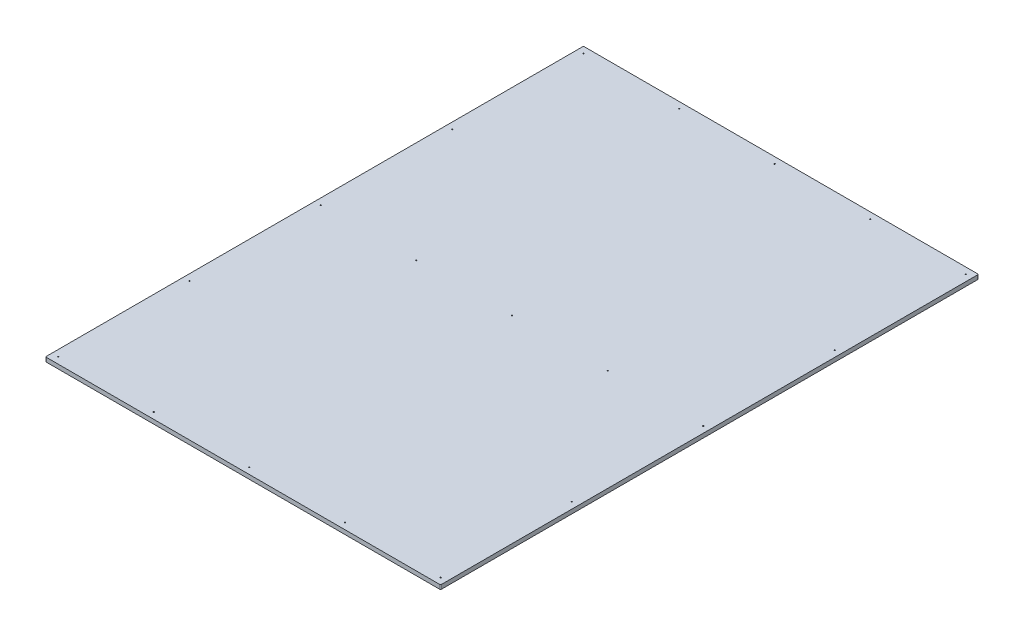
ISO-10303-21;
HEADER;
FILE_DESCRIPTION(('STEP AP214'),'2;1');
FILE_NAME('part.step','',(''),(''),'','','');
FILE_SCHEMA(('AUTOMOTIVE_DESIGN { 1 0 10303 214 1 1 1 1 }'));
ENDSEC;
DATA;
#1=APPLICATION_CONTEXT('core data for automotive mechanical design processes');
#2=APPLICATION_PROTOCOL_DEFINITION('international standard','automotive_design',2000,#1);
#3=PRODUCT_CONTEXT('',#1,'mechanical');
#4=PRODUCT('Part','Part','',(#3));
#5=PRODUCT_RELATED_PRODUCT_CATEGORY('part','',(#4));
#6=PRODUCT_DEFINITION_FORMATION('','',#4);
#7=PRODUCT_DEFINITION_CONTEXT('part definition',#1,'design');
#8=PRODUCT_DEFINITION('design','',#6,#7);
#9=PRODUCT_DEFINITION_SHAPE('','',#8);
#10=(LENGTH_UNIT() NAMED_UNIT(*) SI_UNIT(.MILLI.,.METRE.));
#11=(NAMED_UNIT(*) PLANE_ANGLE_UNIT() SI_UNIT($,.RADIAN.));
#12=(NAMED_UNIT(*) SI_UNIT($,.STERADIAN.) SOLID_ANGLE_UNIT());
#13=UNCERTAINTY_MEASURE_WITH_UNIT(LENGTH_MEASURE(1.E-05),#10,'distance_accuracy_value','');
#14=(GEOMETRIC_REPRESENTATION_CONTEXT(3) GLOBAL_UNCERTAINTY_ASSIGNED_CONTEXT((#13)) GLOBAL_UNIT_ASSIGNED_CONTEXT((#10,
#11,#12)) REPRESENTATION_CONTEXT('',''));
#15=CARTESIAN_POINT('',(0.,0.,0.));
#16=DIRECTION('',(0.,0.,1.));
#17=DIRECTION('',(1.,0.,0.));
#18=AXIS2_PLACEMENT_3D('',#15,#16,#17);
#19=CARTESIAN_POINT('',(0.,12.7,0.));
#20=DIRECTION('',(0.,-1.,0.));
#21=DIRECTION('',(0.,0.,-1.));
#22=AXIS2_PLACEMENT_3D('',#19,#20,#21);
#23=PLANE('',#22);
#24=CARTESIAN_POINT('',(-577.85,12.7,396.875));
#25=DIRECTION('',(0.,1.,0.));
#26=DIRECTION('',(0.,0.,1.));
#27=AXIS2_PLACEMENT_3D('',#24,#25,#26);
#28=CIRCLE('',#27,1.58749999999996);
#29=CARTESIAN_POINT('',(-577.85,12.7,398.4625));
#30=VERTEX_POINT('',#29);
#31=EDGE_CURVE('E287',#30,#30,#28,.T.);
#32=ORIENTED_EDGE('',*,*,#31,.F.);
#33=EDGE_LOOP('',(#32));
#34=FACE_BOUND('',#33,.T.);
#35=CARTESIAN_POINT('',(577.85,12.7,396.875));
#36=DIRECTION('',(0.,1.,0.));
#37=DIRECTION('',(0.,0.,1.));
#38=AXIS2_PLACEMENT_3D('',#35,#36,#37);
#39=CIRCLE('',#38,1.58749999999996);
#40=CARTESIAN_POINT('',(577.85,12.7,398.4625));
#41=VERTEX_POINT('',#40);
#42=EDGE_CURVE('E281',#41,#41,#39,.T.);
#43=ORIENTED_EDGE('',*,*,#42,.F.);
#44=EDGE_LOOP('',(#43));
#45=FACE_BOUND('',#44,.T.);
#46=CARTESIAN_POINT('',(-577.85,12.7,-396.875));
#47=DIRECTION('',(0.,1.,0.));
#48=DIRECTION('',(0.,0.,1.));
#49=AXIS2_PLACEMENT_3D('',#46,#47,#48);
#50=CIRCLE('',#49,1.58749999999996);
#51=CARTESIAN_POINT('',(-577.85,12.7,-395.2875));
#52=VERTEX_POINT('',#51);
#53=EDGE_CURVE('E275',#52,#52,#50,.T.);
#54=ORIENTED_EDGE('',*,*,#53,.F.);
#55=EDGE_LOOP('',(#54));
#56=FACE_BOUND('',#55,.T.);
#57=CARTESIAN_POINT('',(577.85,12.7,-396.875));
#58=DIRECTION('',(0.,1.,0.));
#59=DIRECTION('',(0.,0.,1.));
#60=AXIS2_PLACEMENT_3D('',#57,#58,#59);
#61=CIRCLE('',#60,1.58749999999996);
#62=CARTESIAN_POINT('',(577.85,12.7,-395.2875));
#63=VERTEX_POINT('',#62);
#64=EDGE_CURVE('E269',#63,#63,#61,.T.);
#65=ORIENTED_EDGE('',*,*,#64,.F.);
#66=EDGE_LOOP('',(#65));
#67=FACE_BOUND('',#66,.T.);
#68=CARTESIAN_POINT('',(-577.85,12.7,-793.75));
#69=DIRECTION('',(0.,1.,0.));
#70=DIRECTION('',(0.,0.,1.));
#71=AXIS2_PLACEMENT_3D('',#68,#69,#70);
#72=CIRCLE('',#71,1.58749999999996);
#73=CARTESIAN_POINT('',(-577.85,12.7,-792.1625));
#74=VERTEX_POINT('',#73);
#75=EDGE_CURVE('E257',#74,#74,#72,.T.);
#76=ORIENTED_EDGE('',*,*,#75,.F.);
#77=EDGE_LOOP('',(#76));
#78=FACE_BOUND('',#77,.T.);
#79=CARTESIAN_POINT('',(-288.925,12.7,-793.75));
#80=DIRECTION('',(0.,1.,0.));
#81=DIRECTION('',(0.,0.,1.));
#82=AXIS2_PLACEMENT_3D('',#79,#80,#81);
#83=CIRCLE('',#82,1.58750000000002);
#84=CARTESIAN_POINT('',(-288.925,12.7,-792.1625));
#85=VERTEX_POINT('',#84);
#86=EDGE_CURVE('E251',#85,#85,#83,.T.);
#87=ORIENTED_EDGE('',*,*,#86,.F.);
#88=EDGE_LOOP('',(#87));
#89=FACE_BOUND('',#88,.T.);
#90=CARTESIAN_POINT('',(0.,12.7,-793.75));
#91=DIRECTION('',(0.,1.,0.));
#92=DIRECTION('',(0.,0.,1.));
#93=AXIS2_PLACEMENT_3D('',#90,#91,#92);
#94=CIRCLE('',#93,1.5875);
#95=CARTESIAN_POINT('',(0.,12.7,-792.1625));
#96=VERTEX_POINT('',#95);
#97=EDGE_CURVE('E245',#96,#96,#94,.T.);
#98=ORIENTED_EDGE('',*,*,#97,.F.);
#99=EDGE_LOOP('',(#98));
#100=FACE_BOUND('',#99,.T.);
#101=CARTESIAN_POINT('',(288.925,12.7,-793.75));
#102=DIRECTION('',(0.,1.,0.));
#103=DIRECTION('',(0.,0.,1.));
#104=AXIS2_PLACEMENT_3D('',#101,#102,#103);
#105=CIRCLE('',#104,1.58750000000002);
#106=CARTESIAN_POINT('',(288.925,12.7,-792.1625));
#107=VERTEX_POINT('',#106);
#108=EDGE_CURVE('E239',#107,#107,#105,.T.);
#109=ORIENTED_EDGE('',*,*,#108,.F.);
#110=EDGE_LOOP('',(#109));
#111=FACE_BOUND('',#110,.T.);
#112=CARTESIAN_POINT('',(-288.925,12.7,793.75));
#113=DIRECTION('',(0.,1.,0.));
#114=DIRECTION('',(0.,0.,1.));
#115=AXIS2_PLACEMENT_3D('',#112,#113,#114);
#116=CIRCLE('',#115,1.58750000000002);
#117=CARTESIAN_POINT('',(-288.925,12.7,795.3375));
#118=VERTEX_POINT('',#117);
#119=EDGE_CURVE('E227',#118,#118,#116,.T.);
#120=ORIENTED_EDGE('',*,*,#119,.F.);
#121=EDGE_LOOP('',(#120));
#122=FACE_BOUND('',#121,.T.);
#123=CARTESIAN_POINT('',(288.925,12.7,793.75));
#124=DIRECTION('',(0.,1.,0.));
#125=DIRECTION('',(0.,0.,1.));
#126=AXIS2_PLACEMENT_3D('',#123,#124,#125);
#127=CIRCLE('',#126,1.58750000000002);
#128=CARTESIAN_POINT('',(288.925,12.7,795.3375));
#129=VERTEX_POINT('',#128);
#130=EDGE_CURVE('E215',#129,#129,#127,.T.);
#131=ORIENTED_EDGE('',*,*,#130,.F.);
#132=EDGE_LOOP('',(#131));
#133=FACE_BOUND('',#132,.T.);
#134=CARTESIAN_POINT('',(577.85,12.7,793.75));
#135=DIRECTION('',(0.,1.,0.));
#136=DIRECTION('',(0.,0.,1.));
#137=AXIS2_PLACEMENT_3D('',#134,#135,#136);
#138=CIRCLE('',#137,1.58749999999996);
#139=CARTESIAN_POINT('',(577.85,12.7,795.3375));
#140=VERTEX_POINT('',#139);
#141=EDGE_CURVE('E209',#140,#140,#138,.T.);
#142=ORIENTED_EDGE('',*,*,#141,.F.);
#143=EDGE_LOOP('',(#142));
#144=FACE_BOUND('',#143,.T.);
#145=CARTESIAN_POINT('',(-577.85,12.7,-3.33066907387547E-13));
#146=DIRECTION('',(0.,1.,0.));
#147=DIRECTION('',(0.,0.,1.));
#148=AXIS2_PLACEMENT_3D('',#145,#146,#147);
#149=CIRCLE('',#148,1.58749999999996);
#150=CARTESIAN_POINT('',(-577.85,12.7,1.58749999999963));
#151=VERTEX_POINT('',#150);
#152=EDGE_CURVE('E203',#151,#151,#149,.T.);
#153=ORIENTED_EDGE('',*,*,#152,.F.);
#154=EDGE_LOOP('',(#153));
#155=FACE_BOUND('',#154,.T.);
#156=CARTESIAN_POINT('',(-288.925,12.7,-3.33066907387547E-13));
#157=DIRECTION('',(0.,1.,0.));
#158=DIRECTION('',(0.,0.,1.));
#159=AXIS2_PLACEMENT_3D('',#156,#157,#158);
#160=CIRCLE('',#159,1.58750000000002);
#161=CARTESIAN_POINT('',(-288.925,12.7,1.58749999999969));
#162=VERTEX_POINT('',#161);
#163=EDGE_CURVE('E197',#162,#162,#160,.T.);
#164=ORIENTED_EDGE('',*,*,#163,.F.);
#165=EDGE_LOOP('',(#164));
#166=FACE_BOUND('',#165,.T.);
#167=CARTESIAN_POINT('',(0.,12.7,-3.33066907387547E-13));
#168=DIRECTION('',(0.,1.,0.));
#169=DIRECTION('',(0.,0.,1.));
#170=AXIS2_PLACEMENT_3D('',#167,#168,#169);
#171=CIRCLE('',#170,1.5875);
#172=CARTESIAN_POINT('',(0.,12.7,1.58749999999966));
#173=VERTEX_POINT('',#172);
#174=EDGE_CURVE('E191',#173,#173,#171,.T.);
#175=ORIENTED_EDGE('',*,*,#174,.F.);
#176=EDGE_LOOP('',(#175));
#177=FACE_BOUND('',#176,.T.);
#178=CARTESIAN_POINT('',(288.925,12.7,-3.33066907387547E-13));
#179=DIRECTION('',(0.,1.,0.));
#180=DIRECTION('',(0.,0.,1.));
#181=AXIS2_PLACEMENT_3D('',#178,#179,#180);
#182=CIRCLE('',#181,1.58750000000002);
#183=CARTESIAN_POINT('',(288.925,12.7,1.58749999999969));
#184=VERTEX_POINT('',#183);
#185=EDGE_CURVE('E185',#184,#184,#182,.T.);
#186=ORIENTED_EDGE('',*,*,#185,.F.);
#187=EDGE_LOOP('',(#186));
#188=FACE_BOUND('',#187,.T.);
#189=CARTESIAN_POINT('',(577.85,12.7,-3.33066907387547E-13));
#190=DIRECTION('',(0.,1.,0.));
#191=DIRECTION('',(0.,0.,1.));
#192=AXIS2_PLACEMENT_3D('',#189,#190,#191);
#193=CIRCLE('',#192,1.58749999999996);
#194=CARTESIAN_POINT('',(577.85,12.7,1.58749999999963));
#195=VERTEX_POINT('',#194);
#196=EDGE_CURVE('E179',#195,#195,#193,.T.);
#197=ORIENTED_EDGE('',*,*,#196,.F.);
#198=EDGE_LOOP('',(#197));
#199=FACE_BOUND('',#198,.T.);
#200=DIRECTION('',(0.,0.,-1.));
#201=VECTOR('',#200,1.);
#202=CARTESIAN_POINT('',(596.9,12.7,812.8));
#203=LINE('',#202,#201);
#204=CARTESIAN_POINT('',(596.9,12.7,810.26));
#205=VERTEX_POINT('',#204);
#206=CARTESIAN_POINT('',(596.9,12.7,-810.26));
#207=VERTEX_POINT('',#206);
#208=EDGE_CURVE('E137',#205,#207,#203,.T.);
#209=ORIENTED_EDGE('',*,*,#208,.T.);
#210=CARTESIAN_POINT('',(594.36,12.7,-810.26));
#211=DIRECTION('',(0.,-1.,0.));
#212=DIRECTION('',(0.,0.,-1.));
#213=AXIS2_PLACEMENT_3D('',#210,#211,#212);
#214=CIRCLE('',#213,2.54);
#215=CARTESIAN_POINT('',(594.36,12.7,-812.8));
#216=VERTEX_POINT('',#215);
#217=EDGE_CURVE('E152',#207,#216,#214,.F.);
#218=ORIENTED_EDGE('',*,*,#217,.T.);
#219=DIRECTION('',(-1.,0.,0.));
#220=VECTOR('',#219,1.);
#221=CARTESIAN_POINT('',(-596.9,12.7,-812.8));
#222=LINE('',#221,#220);
#223=CARTESIAN_POINT('',(-594.36,12.7,-812.8));
#224=VERTEX_POINT('',#223);
#225=EDGE_CURVE('E120',#216,#224,#222,.T.);
#226=ORIENTED_EDGE('',*,*,#225,.T.);
#227=CARTESIAN_POINT('',(-594.36,12.7,-810.26));
#228=DIRECTION('',(0.,-1.,0.));
#229=DIRECTION('',(0.,0.,-1.));
#230=AXIS2_PLACEMENT_3D('',#227,#228,#229);
#231=CIRCLE('',#230,2.54);
#232=CARTESIAN_POINT('',(-596.9,12.7,-810.26));
#233=VERTEX_POINT('',#232);
#234=EDGE_CURVE('E150',#224,#233,#231,.F.);
#235=ORIENTED_EDGE('',*,*,#234,.T.);
#236=DIRECTION('',(0.,0.,1.));
#237=VECTOR('',#236,1.);
#238=CARTESIAN_POINT('',(-596.9,12.7,812.8));
#239=LINE('',#238,#237);
#240=CARTESIAN_POINT('',(-596.9,12.7,810.26));
#241=VERTEX_POINT('',#240);
#242=EDGE_CURVE('E163',#233,#241,#239,.T.);
#243=ORIENTED_EDGE('',*,*,#242,.T.);
#244=CARTESIAN_POINT('',(-594.36,12.7,810.26));
#245=DIRECTION('',(0.,-1.,0.));
#246=DIRECTION('',(0.,0.,-1.));
#247=AXIS2_PLACEMENT_3D('',#244,#245,#246);
#248=CIRCLE('',#247,2.54);
#249=CARTESIAN_POINT('',(-594.36,12.7,812.8));
#250=VERTEX_POINT('',#249);
#251=EDGE_CURVE('E55',#241,#250,#248,.F.);
#252=ORIENTED_EDGE('',*,*,#251,.T.);
#253=DIRECTION('',(1.,0.,0.));
#254=VECTOR('',#253,1.);
#255=CARTESIAN_POINT('',(-596.9,12.7,812.8));
#256=LINE('',#255,#254);
#257=CARTESIAN_POINT('',(594.36,12.7,812.8));
#258=VERTEX_POINT('',#257);
#259=EDGE_CURVE('E138',#250,#258,#256,.T.);
#260=ORIENTED_EDGE('',*,*,#259,.T.);
#261=CARTESIAN_POINT('',(594.36,12.7,810.26));
#262=DIRECTION('',(0.,-1.,0.));
#263=DIRECTION('',(0.,0.,-1.));
#264=AXIS2_PLACEMENT_3D('',#261,#262,#263);
#265=CIRCLE('',#264,2.54);
#266=EDGE_CURVE('E147',#258,#205,#265,.F.);
#267=ORIENTED_EDGE('',*,*,#266,.T.);
#268=EDGE_LOOP('',(#209,#218,#226,#235,#243,#252,#260,#267));
#269=FACE_BOUND('',#268,.T.);
#270=CARTESIAN_POINT('',(0.,12.7,793.75));
#271=DIRECTION('',(0.,1.,0.));
#272=DIRECTION('',(0.,0.,1.));
#273=AXIS2_PLACEMENT_3D('',#270,#271,#272);
#274=CIRCLE('',#273,1.5875);
#275=CARTESIAN_POINT('',(0.,12.7,795.3375));
#276=VERTEX_POINT('',#275);
#277=EDGE_CURVE('E221',#276,#276,#274,.T.);
#278=ORIENTED_EDGE('',*,*,#277,.F.);
#279=EDGE_LOOP('',(#278));
#280=FACE_BOUND('',#279,.T.);
#281=CARTESIAN_POINT('',(577.85,12.7,-793.75));
#282=DIRECTION('',(0.,1.,0.));
#283=DIRECTION('',(0.,0.,1.));
#284=AXIS2_PLACEMENT_3D('',#281,#282,#283);
#285=CIRCLE('',#284,1.58749999999996);
#286=CARTESIAN_POINT('',(577.85,12.7,-792.1625));
#287=VERTEX_POINT('',#286);
#288=EDGE_CURVE('E233',#287,#287,#285,.T.);
#289=ORIENTED_EDGE('',*,*,#288,.F.);
#290=EDGE_LOOP('',(#289));
#291=FACE_BOUND('',#290,.T.);
#292=CARTESIAN_POINT('',(-577.85,12.7,793.75));
#293=DIRECTION('',(0.,1.,0.));
#294=DIRECTION('',(0.,0.,1.));
#295=AXIS2_PLACEMENT_3D('',#292,#293,#294);
#296=CIRCLE('',#295,1.58749999999996);
#297=CARTESIAN_POINT('',(-577.85,12.7,795.3375));
#298=VERTEX_POINT('',#297);
#299=EDGE_CURVE('E263',#298,#298,#296,.T.);
#300=ORIENTED_EDGE('',*,*,#299,.F.);
#301=EDGE_LOOP('',(#300));
#302=FACE_BOUND('',#301,.T.);
#303=ADVANCED_FACE('F34',(#34,#45,#56,#67,#78,#89,#100,#111,#122,#133,#144,#155,#166,#177,#188,
#199,#269,#280,#291,#302),#23,.F.);
#304=CARTESIAN_POINT('',(596.9,12.7,812.8));
#305=DIRECTION('',(-1.,0.,0.));
#306=DIRECTION('',(0.,0.,1.));
#307=AXIS2_PLACEMENT_3D('',#304,#305,#306);
#308=PLANE('',#307);
#309=DIRECTION('',(0.,0.,-1.));
#310=VECTOR('',#309,1.);
#311=CARTESIAN_POINT('',(596.9,0.,812.8));
#312=LINE('',#311,#310);
#313=CARTESIAN_POINT('',(596.9,0.,810.26));
#314=VERTEX_POINT('',#313);
#315=CARTESIAN_POINT('',(596.9,0.,-810.26));
#316=VERTEX_POINT('',#315);
#317=EDGE_CURVE('E127',#314,#316,#312,.T.);
#318=ORIENTED_EDGE('',*,*,#317,.T.);
#319=DIRECTION('',(0.,-1.,0.));
#320=VECTOR('',#319,1.);
#321=CARTESIAN_POINT('',(596.9,12.7,-810.26));
#322=LINE('',#321,#320);
#323=EDGE_CURVE('E105',#316,#207,#322,.F.);
#324=ORIENTED_EDGE('',*,*,#323,.T.);
#325=ORIENTED_EDGE('',*,*,#208,.F.);
#326=DIRECTION('',(0.,-1.,0.));
#327=VECTOR('',#326,1.);
#328=CARTESIAN_POINT('',(596.9,12.7,810.26));
#329=LINE('',#328,#327);
#330=EDGE_CURVE('E110',#205,#314,#329,.T.);
#331=ORIENTED_EDGE('',*,*,#330,.T.);
#332=EDGE_LOOP('',(#318,#324,#325,#331));
#333=FACE_BOUND('',#332,.T.);
#334=ADVANCED_FACE('F296',(#333),#308,.F.);
#335=CARTESIAN_POINT('',(-596.9,12.7,-812.8));
#336=DIRECTION('',(0.,0.,1.));
#337=DIRECTION('',(1.,0.,0.));
#338=AXIS2_PLACEMENT_3D('',#335,#336,#337);
#339=PLANE('',#338);
#340=ORIENTED_EDGE('',*,*,#225,.F.);
#341=DIRECTION('',(0.,-1.,0.));
#342=VECTOR('',#341,1.);
#343=CARTESIAN_POINT('',(594.36,12.7,-812.8));
#344=LINE('',#343,#342);
#345=CARTESIAN_POINT('',(594.36,0.,-812.8));
#346=VERTEX_POINT('',#345);
#347=EDGE_CURVE('E104',#216,#346,#344,.T.);
#348=ORIENTED_EDGE('',*,*,#347,.T.);
#349=DIRECTION('',(-1.,0.,0.));
#350=VECTOR('',#349,1.);
#351=CARTESIAN_POINT('',(-596.9,0.,-812.8));
#352=LINE('',#351,#350);
#353=CARTESIAN_POINT('',(-594.36,0.,-812.8));
#354=VERTEX_POINT('',#353);
#355=EDGE_CURVE('E117',#346,#354,#352,.T.);
#356=ORIENTED_EDGE('',*,*,#355,.T.);
#357=DIRECTION('',(0.,-1.,0.));
#358=VECTOR('',#357,1.);
#359=CARTESIAN_POINT('',(-594.36,12.7,-812.8));
#360=LINE('',#359,#358);
#361=EDGE_CURVE('E122',#354,#224,#360,.F.);
#362=ORIENTED_EDGE('',*,*,#361,.T.);
#363=EDGE_LOOP('',(#340,#348,#356,#362));
#364=FACE_BOUND('',#363,.T.);
#365=ADVANCED_FACE('F116',(#364),#339,.F.);
#366=CARTESIAN_POINT('',(-596.9,12.7,812.8));
#367=DIRECTION('',(1.,0.,0.));
#368=DIRECTION('',(0.,0.,-1.));
#369=AXIS2_PLACEMENT_3D('',#366,#367,#368);
#370=PLANE('',#369);
#371=ORIENTED_EDGE('',*,*,#242,.F.);
#372=DIRECTION('',(0.,-1.,0.));
#373=VECTOR('',#372,1.);
#374=CARTESIAN_POINT('',(-596.9,12.7,-810.26));
#375=LINE('',#374,#373);
#376=CARTESIAN_POINT('',(-596.9,0.,-810.26));
#377=VERTEX_POINT('',#376);
#378=EDGE_CURVE('E156',#233,#377,#375,.T.);
#379=ORIENTED_EDGE('',*,*,#378,.T.);
#380=DIRECTION('',(0.,0.,1.));
#381=VECTOR('',#380,1.);
#382=CARTESIAN_POINT('',(-596.9,0.,812.8));
#383=LINE('',#382,#381);
#384=CARTESIAN_POINT('',(-596.9,0.,810.26));
#385=VERTEX_POINT('',#384);
#386=EDGE_CURVE('E126',#377,#385,#383,.T.);
#387=ORIENTED_EDGE('',*,*,#386,.T.);
#388=DIRECTION('',(0.,-1.,0.));
#389=VECTOR('',#388,1.);
#390=CARTESIAN_POINT('',(-596.9,12.7,810.26));
#391=LINE('',#390,#389);
#392=EDGE_CURVE('E154',#385,#241,#391,.F.);
#393=ORIENTED_EDGE('',*,*,#392,.T.);
#394=EDGE_LOOP('',(#371,#379,#387,#393));
#395=FACE_BOUND('',#394,.T.);
#396=ADVANCED_FACE('F161',(#395),#370,.F.);
#397=CARTESIAN_POINT('',(-596.9,12.7,812.8));
#398=DIRECTION('',(0.,0.,-1.));
#399=DIRECTION('',(-1.,0.,0.));
#400=AXIS2_PLACEMENT_3D('',#397,#398,#399);
#401=PLANE('',#400);
#402=ORIENTED_EDGE('',*,*,#259,.F.);
#403=DIRECTION('',(0.,-1.,0.));
#404=VECTOR('',#403,1.);
#405=CARTESIAN_POINT('',(-594.36,12.7,812.8));
#406=LINE('',#405,#404);
#407=CARTESIAN_POINT('',(-594.36,0.,812.8));
#408=VERTEX_POINT('',#407);
#409=EDGE_CURVE('E11',#250,#408,#406,.T.);
#410=ORIENTED_EDGE('',*,*,#409,.T.);
#411=DIRECTION('',(1.,0.,0.));
#412=VECTOR('',#411,1.);
#413=CARTESIAN_POINT('',(-596.9,0.,812.8));
#414=LINE('',#413,#412);
#415=CARTESIAN_POINT('',(594.36,0.,812.8));
#416=VERTEX_POINT('',#415);
#417=EDGE_CURVE('E130',#408,#416,#414,.T.);
#418=ORIENTED_EDGE('',*,*,#417,.T.);
#419=DIRECTION('',(0.,-1.,0.));
#420=VECTOR('',#419,1.);
#421=CARTESIAN_POINT('',(594.36,12.7,812.8));
#422=LINE('',#421,#420);
#423=EDGE_CURVE('E42',#416,#258,#422,.F.);
#424=ORIENTED_EDGE('',*,*,#423,.T.);
#425=EDGE_LOOP('',(#402,#410,#418,#424));
#426=FACE_BOUND('',#425,.T.);
#427=ADVANCED_FACE('F170',(#426),#401,.F.);
#428=CARTESIAN_POINT('',(0.,0.,0.));
#429=DIRECTION('',(0.,-1.,0.));
#430=DIRECTION('',(0.,0.,-1.));
#431=AXIS2_PLACEMENT_3D('',#428,#429,#430);
#432=PLANE('',#431);
#433=CARTESIAN_POINT('',(-577.85,0.,396.875));
#434=DIRECTION('',(0.,-1.,0.));
#435=DIRECTION('',(0.,0.,-1.));
#436=AXIS2_PLACEMENT_3D('',#433,#434,#435);
#437=CIRCLE('',#436,1.58749999999996);
#438=CARTESIAN_POINT('',(-577.85,0.,395.2875));
#439=VERTEX_POINT('',#438);
#440=EDGE_CURVE('E284',#439,#439,#437,.T.);
#441=ORIENTED_EDGE('',*,*,#440,.F.);
#442=EDGE_LOOP('',(#441));
#443=FACE_BOUND('',#442,.T.);
#444=CARTESIAN_POINT('',(577.85,0.,396.875));
#445=DIRECTION('',(0.,-1.,0.));
#446=DIRECTION('',(0.,0.,-1.));
#447=AXIS2_PLACEMENT_3D('',#444,#445,#446);
#448=CIRCLE('',#447,1.58749999999996);
#449=CARTESIAN_POINT('',(577.85,0.,395.2875));
#450=VERTEX_POINT('',#449);
#451=EDGE_CURVE('E278',#450,#450,#448,.T.);
#452=ORIENTED_EDGE('',*,*,#451,.F.);
#453=EDGE_LOOP('',(#452));
#454=FACE_BOUND('',#453,.T.);
#455=CARTESIAN_POINT('',(-577.85,0.,-396.875));
#456=DIRECTION('',(0.,-1.,0.));
#457=DIRECTION('',(0.,0.,-1.));
#458=AXIS2_PLACEMENT_3D('',#455,#456,#457);
#459=CIRCLE('',#458,1.58749999999996);
#460=CARTESIAN_POINT('',(-577.85,0.,-398.4625));
#461=VERTEX_POINT('',#460);
#462=EDGE_CURVE('E272',#461,#461,#459,.T.);
#463=ORIENTED_EDGE('',*,*,#462,.F.);
#464=EDGE_LOOP('',(#463));
#465=FACE_BOUND('',#464,.T.);
#466=CARTESIAN_POINT('',(577.85,0.,-396.875));
#467=DIRECTION('',(0.,-1.,0.));
#468=DIRECTION('',(0.,0.,-1.));
#469=AXIS2_PLACEMENT_3D('',#466,#467,#468);
#470=CIRCLE('',#469,1.58749999999996);
#471=CARTESIAN_POINT('',(577.85,0.,-398.4625));
#472=VERTEX_POINT('',#471);
#473=EDGE_CURVE('E266',#472,#472,#470,.T.);
#474=ORIENTED_EDGE('',*,*,#473,.F.);
#475=EDGE_LOOP('',(#474));
#476=FACE_BOUND('',#475,.T.);
#477=CARTESIAN_POINT('',(-577.85,0.,793.75));
#478=DIRECTION('',(0.,-1.,0.));
#479=DIRECTION('',(0.,0.,-1.));
#480=AXIS2_PLACEMENT_3D('',#477,#478,#479);
#481=CIRCLE('',#480,1.58749999999996);
#482=CARTESIAN_POINT('',(-577.85,0.,792.1625));
#483=VERTEX_POINT('',#482);
#484=EDGE_CURVE('E260',#483,#483,#481,.T.);
#485=ORIENTED_EDGE('',*,*,#484,.F.);
#486=EDGE_LOOP('',(#485));
#487=FACE_BOUND('',#486,.T.);
#488=CARTESIAN_POINT('',(-577.85,0.,-793.75));
#489=DIRECTION('',(0.,-1.,0.));
#490=DIRECTION('',(0.,0.,-1.));
#491=AXIS2_PLACEMENT_3D('',#488,#489,#490);
#492=CIRCLE('',#491,1.58749999999996);
#493=CARTESIAN_POINT('',(-577.85,0.,-795.3375));
#494=VERTEX_POINT('',#493);
#495=EDGE_CURVE('E254',#494,#494,#492,.T.);
#496=ORIENTED_EDGE('',*,*,#495,.F.);
#497=EDGE_LOOP('',(#496));
#498=FACE_BOUND('',#497,.T.);
#499=CARTESIAN_POINT('',(-288.925,0.,-793.75));
#500=DIRECTION('',(0.,-1.,0.));
#501=DIRECTION('',(0.,0.,-1.));
#502=AXIS2_PLACEMENT_3D('',#499,#500,#501);
#503=CIRCLE('',#502,1.58750000000002);
#504=CARTESIAN_POINT('',(-288.925,0.,-795.3375));
#505=VERTEX_POINT('',#504);
#506=EDGE_CURVE('E248',#505,#505,#503,.T.);
#507=ORIENTED_EDGE('',*,*,#506,.F.);
#508=EDGE_LOOP('',(#507));
#509=FACE_BOUND('',#508,.T.);
#510=CARTESIAN_POINT('',(0.,0.,-793.75));
#511=DIRECTION('',(0.,-1.,0.));
#512=DIRECTION('',(0.,0.,-1.));
#513=AXIS2_PLACEMENT_3D('',#510,#511,#512);
#514=CIRCLE('',#513,1.5875);
#515=CARTESIAN_POINT('',(0.,0.,-795.3375));
#516=VERTEX_POINT('',#515);
#517=EDGE_CURVE('E242',#516,#516,#514,.T.);
#518=ORIENTED_EDGE('',*,*,#517,.F.);
#519=EDGE_LOOP('',(#518));
#520=FACE_BOUND('',#519,.T.);
#521=CARTESIAN_POINT('',(288.925,0.,-793.75));
#522=DIRECTION('',(0.,-1.,0.));
#523=DIRECTION('',(0.,0.,-1.));
#524=AXIS2_PLACEMENT_3D('',#521,#522,#523);
#525=CIRCLE('',#524,1.58750000000002);
#526=CARTESIAN_POINT('',(288.925,0.,-795.3375));
#527=VERTEX_POINT('',#526);
#528=EDGE_CURVE('E236',#527,#527,#525,.T.);
#529=ORIENTED_EDGE('',*,*,#528,.F.);
#530=EDGE_LOOP('',(#529));
#531=FACE_BOUND('',#530,.T.);
#532=CARTESIAN_POINT('',(577.85,0.,-793.75));
#533=DIRECTION('',(0.,-1.,0.));
#534=DIRECTION('',(0.,0.,-1.));
#535=AXIS2_PLACEMENT_3D('',#532,#533,#534);
#536=CIRCLE('',#535,1.58749999999996);
#537=CARTESIAN_POINT('',(577.85,0.,-795.3375));
#538=VERTEX_POINT('',#537);
#539=EDGE_CURVE('E230',#538,#538,#536,.T.);
#540=ORIENTED_EDGE('',*,*,#539,.F.);
#541=EDGE_LOOP('',(#540));
#542=FACE_BOUND('',#541,.T.);
#543=CARTESIAN_POINT('',(-288.925,0.,793.75));
#544=DIRECTION('',(0.,-1.,0.));
#545=DIRECTION('',(0.,0.,-1.));
#546=AXIS2_PLACEMENT_3D('',#543,#544,#545);
#547=CIRCLE('',#546,1.58750000000002);
#548=CARTESIAN_POINT('',(-288.925,0.,792.1625));
#549=VERTEX_POINT('',#548);
#550=EDGE_CURVE('E224',#549,#549,#547,.T.);
#551=ORIENTED_EDGE('',*,*,#550,.F.);
#552=EDGE_LOOP('',(#551));
#553=FACE_BOUND('',#552,.T.);
#554=CARTESIAN_POINT('',(0.,0.,793.75));
#555=DIRECTION('',(0.,-1.,0.));
#556=DIRECTION('',(0.,0.,-1.));
#557=AXIS2_PLACEMENT_3D('',#554,#555,#556);
#558=CIRCLE('',#557,1.5875);
#559=CARTESIAN_POINT('',(0.,0.,792.1625));
#560=VERTEX_POINT('',#559);
#561=EDGE_CURVE('E218',#560,#560,#558,.T.);
#562=ORIENTED_EDGE('',*,*,#561,.F.);
#563=EDGE_LOOP('',(#562));
#564=FACE_BOUND('',#563,.T.);
#565=CARTESIAN_POINT('',(288.925,0.,793.75));
#566=DIRECTION('',(0.,-1.,0.));
#567=DIRECTION('',(0.,0.,-1.));
#568=AXIS2_PLACEMENT_3D('',#565,#566,#567);
#569=CIRCLE('',#568,1.58750000000002);
#570=CARTESIAN_POINT('',(288.925,0.,792.1625));
#571=VERTEX_POINT('',#570);
#572=EDGE_CURVE('E212',#571,#571,#569,.T.);
#573=ORIENTED_EDGE('',*,*,#572,.F.);
#574=EDGE_LOOP('',(#573));
#575=FACE_BOUND('',#574,.T.);
#576=CARTESIAN_POINT('',(577.85,0.,793.75));
#577=DIRECTION('',(0.,-1.,0.));
#578=DIRECTION('',(0.,0.,-1.));
#579=AXIS2_PLACEMENT_3D('',#576,#577,#578);
#580=CIRCLE('',#579,1.58749999999996);
#581=CARTESIAN_POINT('',(577.85,0.,792.1625));
#582=VERTEX_POINT('',#581);
#583=EDGE_CURVE('E206',#582,#582,#580,.T.);
#584=ORIENTED_EDGE('',*,*,#583,.F.);
#585=EDGE_LOOP('',(#584));
#586=FACE_BOUND('',#585,.T.);
#587=CARTESIAN_POINT('',(-577.85,0.,-3.33066907387547E-13));
#588=DIRECTION('',(0.,-1.,0.));
#589=DIRECTION('',(0.,0.,-1.));
#590=AXIS2_PLACEMENT_3D('',#587,#588,#589);
#591=CIRCLE('',#590,1.58749999999996);
#592=CARTESIAN_POINT('',(-577.85,0.,-1.5875000000003));
#593=VERTEX_POINT('',#592);
#594=EDGE_CURVE('E200',#593,#593,#591,.T.);
#595=ORIENTED_EDGE('',*,*,#594,.F.);
#596=EDGE_LOOP('',(#595));
#597=FACE_BOUND('',#596,.T.);
#598=CARTESIAN_POINT('',(-288.925,0.,-3.33066907387547E-13));
#599=DIRECTION('',(0.,-1.,0.));
#600=DIRECTION('',(0.,0.,-1.));
#601=AXIS2_PLACEMENT_3D('',#598,#599,#600);
#602=CIRCLE('',#601,1.58750000000002);
#603=CARTESIAN_POINT('',(-288.925,0.,-1.58750000000035));
#604=VERTEX_POINT('',#603);
#605=EDGE_CURVE('E194',#604,#604,#602,.T.);
#606=ORIENTED_EDGE('',*,*,#605,.F.);
#607=EDGE_LOOP('',(#606));
#608=FACE_BOUND('',#607,.T.);
#609=CARTESIAN_POINT('',(0.,0.,-3.33066907387547E-13));
#610=DIRECTION('',(0.,-1.,0.));
#611=DIRECTION('',(0.,0.,-1.));
#612=AXIS2_PLACEMENT_3D('',#609,#610,#611);
#613=CIRCLE('',#612,1.5875);
#614=CARTESIAN_POINT('',(0.,0.,-1.58750000000033));
#615=VERTEX_POINT('',#614);
#616=EDGE_CURVE('E188',#615,#615,#613,.T.);
#617=ORIENTED_EDGE('',*,*,#616,.F.);
#618=EDGE_LOOP('',(#617));
#619=FACE_BOUND('',#618,.T.);
#620=CARTESIAN_POINT('',(288.925,0.,-3.33066907387547E-13));
#621=DIRECTION('',(0.,-1.,0.));
#622=DIRECTION('',(0.,0.,-1.));
#623=AXIS2_PLACEMENT_3D('',#620,#621,#622);
#624=CIRCLE('',#623,1.58750000000002);
#625=CARTESIAN_POINT('',(288.925,0.,-1.58750000000035));
#626=VERTEX_POINT('',#625);
#627=EDGE_CURVE('E182',#626,#626,#624,.T.);
#628=ORIENTED_EDGE('',*,*,#627,.F.);
#629=EDGE_LOOP('',(#628));
#630=FACE_BOUND('',#629,.T.);
#631=CARTESIAN_POINT('',(577.85,0.,-3.33066907387547E-13));
#632=DIRECTION('',(0.,-1.,0.));
#633=DIRECTION('',(0.,0.,-1.));
#634=AXIS2_PLACEMENT_3D('',#631,#632,#633);
#635=CIRCLE('',#634,1.58749999999996);
#636=CARTESIAN_POINT('',(577.85,0.,-1.5875000000003));
#637=VERTEX_POINT('',#636);
#638=EDGE_CURVE('E132',#637,#637,#635,.T.);
#639=ORIENTED_EDGE('',*,*,#638,.F.);
#640=EDGE_LOOP('',(#639));
#641=FACE_BOUND('',#640,.T.);
#642=ORIENTED_EDGE('',*,*,#355,.F.);
#643=CARTESIAN_POINT('',(594.36,0.,-810.26));
#644=DIRECTION('',(0.,-1.,0.));
#645=DIRECTION('',(0.,0.,-1.));
#646=AXIS2_PLACEMENT_3D('',#643,#644,#645);
#647=CIRCLE('',#646,2.54);
#648=EDGE_CURVE('E100',#346,#316,#647,.T.);
#649=ORIENTED_EDGE('',*,*,#648,.T.);
#650=ORIENTED_EDGE('',*,*,#317,.F.);
#651=CARTESIAN_POINT('',(594.36,0.,810.26));
#652=DIRECTION('',(0.,-1.,0.));
#653=DIRECTION('',(0.,0.,-1.));
#654=AXIS2_PLACEMENT_3D('',#651,#652,#653);
#655=CIRCLE('',#654,2.54);
#656=EDGE_CURVE('E121',#314,#416,#655,.T.);
#657=ORIENTED_EDGE('',*,*,#656,.T.);
#658=ORIENTED_EDGE('',*,*,#417,.F.);
#659=CARTESIAN_POINT('',(-594.36,0.,810.26));
#660=DIRECTION('',(0.,-1.,0.));
#661=DIRECTION('',(0.,0.,-1.));
#662=AXIS2_PLACEMENT_3D('',#659,#660,#661);
#663=CIRCLE('',#662,2.54);
#664=EDGE_CURVE('E141',#408,#385,#663,.T.);
#665=ORIENTED_EDGE('',*,*,#664,.T.);
#666=ORIENTED_EDGE('',*,*,#386,.F.);
#667=CARTESIAN_POINT('',(-594.36,0.,-810.26));
#668=DIRECTION('',(0.,-1.,0.));
#669=DIRECTION('',(0.,0.,-1.));
#670=AXIS2_PLACEMENT_3D('',#667,#668,#669);
#671=CIRCLE('',#670,2.54);
#672=EDGE_CURVE('E111',#377,#354,#671,.T.);
#673=ORIENTED_EDGE('',*,*,#672,.T.);
#674=EDGE_LOOP('',(#642,#649,#650,#657,#658,#665,#666,#673));
#675=FACE_BOUND('',#674,.T.);
#676=ADVANCED_FACE('F124',(#443,#454,#465,#476,#487,#498,#509,#520,#531,#542,#553,#564,#575,
#586,#597,#608,#619,#630,#641,#675),#432,.T.);
#677=CARTESIAN_POINT('',(577.85,12.7,-3.33066907387547E-13));
#678=DIRECTION('',(0.,1.,0.));
#679=DIRECTION('',(0.,0.,1.));
#680=AXIS2_PLACEMENT_3D('',#677,#678,#679);
#681=CYLINDRICAL_SURFACE('',#680,1.58749999999996);
#682=ORIENTED_EDGE('',*,*,#196,.T.);
#683=EDGE_LOOP('',(#682));
#684=FACE_BOUND('',#683,.T.);
#685=ORIENTED_EDGE('',*,*,#638,.T.);
#686=EDGE_LOOP('',(#685));
#687=FACE_BOUND('',#686,.T.);
#688=ADVANCED_FACE('F345',(#684,#687),#681,.F.);
#689=CARTESIAN_POINT('',(288.925,12.7,-3.33066907387547E-13));
#690=DIRECTION('',(0.,1.,0.));
#691=DIRECTION('',(0.,0.,1.));
#692=AXIS2_PLACEMENT_3D('',#689,#690,#691);
#693=CYLINDRICAL_SURFACE('',#692,1.58750000000002);
#694=ORIENTED_EDGE('',*,*,#185,.T.);
#695=EDGE_LOOP('',(#694));
#696=FACE_BOUND('',#695,.T.);
#697=ORIENTED_EDGE('',*,*,#627,.T.);
#698=EDGE_LOOP('',(#697));
#699=FACE_BOUND('',#698,.T.);
#700=ADVANCED_FACE('F377',(#696,#699),#693,.F.);
#701=CARTESIAN_POINT('',(0.,12.7,-3.33066907387547E-13));
#702=DIRECTION('',(0.,1.,0.));
#703=DIRECTION('',(0.,0.,1.));
#704=AXIS2_PLACEMENT_3D('',#701,#702,#703);
#705=CYLINDRICAL_SURFACE('',#704,1.5875);
#706=ORIENTED_EDGE('',*,*,#174,.T.);
#707=EDGE_LOOP('',(#706));
#708=FACE_BOUND('',#707,.T.);
#709=ORIENTED_EDGE('',*,*,#616,.T.);
#710=EDGE_LOOP('',(#709));
#711=FACE_BOUND('',#710,.T.);
#712=ADVANCED_FACE('F383',(#708,#711),#705,.F.);
#713=CARTESIAN_POINT('',(-288.925,12.7,-3.33066907387547E-13));
#714=DIRECTION('',(0.,1.,0.));
#715=DIRECTION('',(0.,0.,1.));
#716=AXIS2_PLACEMENT_3D('',#713,#714,#715);
#717=CYLINDRICAL_SURFACE('',#716,1.58750000000002);
#718=ORIENTED_EDGE('',*,*,#163,.T.);
#719=EDGE_LOOP('',(#718));
#720=FACE_BOUND('',#719,.T.);
#721=ORIENTED_EDGE('',*,*,#605,.T.);
#722=EDGE_LOOP('',(#721));
#723=FACE_BOUND('',#722,.T.);
#724=ADVANCED_FACE('F604',(#720,#723),#717,.F.);
#725=CARTESIAN_POINT('',(-577.85,12.7,-3.33066907387547E-13));
#726=DIRECTION('',(0.,1.,0.));
#727=DIRECTION('',(0.,0.,1.));
#728=AXIS2_PLACEMENT_3D('',#725,#726,#727);
#729=CYLINDRICAL_SURFACE('',#728,1.58749999999996);
#730=ORIENTED_EDGE('',*,*,#152,.T.);
#731=EDGE_LOOP('',(#730));
#732=FACE_BOUND('',#731,.T.);
#733=ORIENTED_EDGE('',*,*,#594,.T.);
#734=EDGE_LOOP('',(#733));
#735=FACE_BOUND('',#734,.T.);
#736=ADVANCED_FACE('F594',(#732,#735),#729,.F.);
#737=CARTESIAN_POINT('',(577.85,12.7,793.75));
#738=DIRECTION('',(0.,1.,0.));
#739=DIRECTION('',(0.,0.,1.));
#740=AXIS2_PLACEMENT_3D('',#737,#738,#739);
#741=CYLINDRICAL_SURFACE('',#740,1.58749999999996);
#742=ORIENTED_EDGE('',*,*,#141,.T.);
#743=EDGE_LOOP('',(#742));
#744=FACE_BOUND('',#743,.T.);
#745=ORIENTED_EDGE('',*,*,#583,.T.);
#746=EDGE_LOOP('',(#745));
#747=FACE_BOUND('',#746,.T.);
#748=ADVANCED_FACE('F584',(#744,#747),#741,.F.);
#749=CARTESIAN_POINT('',(288.925,12.7,793.75));
#750=DIRECTION('',(0.,1.,0.));
#751=DIRECTION('',(0.,0.,1.));
#752=AXIS2_PLACEMENT_3D('',#749,#750,#751);
#753=CYLINDRICAL_SURFACE('',#752,1.58750000000002);
#754=ORIENTED_EDGE('',*,*,#130,.T.);
#755=EDGE_LOOP('',(#754));
#756=FACE_BOUND('',#755,.T.);
#757=ORIENTED_EDGE('',*,*,#572,.T.);
#758=EDGE_LOOP('',(#757));
#759=FACE_BOUND('',#758,.T.);
#760=ADVANCED_FACE('F574',(#756,#759),#753,.F.);
#761=CARTESIAN_POINT('',(0.,12.7,793.75));
#762=DIRECTION('',(0.,1.,0.));
#763=DIRECTION('',(0.,0.,1.));
#764=AXIS2_PLACEMENT_3D('',#761,#762,#763);
#765=CYLINDRICAL_SURFACE('',#764,1.5875);
#766=ORIENTED_EDGE('',*,*,#277,.T.);
#767=EDGE_LOOP('',(#766));
#768=FACE_BOUND('',#767,.T.);
#769=ORIENTED_EDGE('',*,*,#561,.T.);
#770=EDGE_LOOP('',(#769));
#771=FACE_BOUND('',#770,.T.);
#772=ADVANCED_FACE('F564',(#768,#771),#765,.F.);
#773=CARTESIAN_POINT('',(-288.925,12.7,793.75));
#774=DIRECTION('',(0.,1.,0.));
#775=DIRECTION('',(0.,0.,1.));
#776=AXIS2_PLACEMENT_3D('',#773,#774,#775);
#777=CYLINDRICAL_SURFACE('',#776,1.58750000000002);
#778=ORIENTED_EDGE('',*,*,#119,.T.);
#779=EDGE_LOOP('',(#778));
#780=FACE_BOUND('',#779,.T.);
#781=ORIENTED_EDGE('',*,*,#550,.T.);
#782=EDGE_LOOP('',(#781));
#783=FACE_BOUND('',#782,.T.);
#784=ADVANCED_FACE('F554',(#780,#783),#777,.F.);
#785=CARTESIAN_POINT('',(577.85,12.7,-793.75));
#786=DIRECTION('',(0.,1.,0.));
#787=DIRECTION('',(0.,0.,1.));
#788=AXIS2_PLACEMENT_3D('',#785,#786,#787);
#789=CYLINDRICAL_SURFACE('',#788,1.58749999999996);
#790=ORIENTED_EDGE('',*,*,#288,.T.);
#791=EDGE_LOOP('',(#790));
#792=FACE_BOUND('',#791,.T.);
#793=ORIENTED_EDGE('',*,*,#539,.T.);
#794=EDGE_LOOP('',(#793));
#795=FACE_BOUND('',#794,.T.);
#796=ADVANCED_FACE('F544',(#792,#795),#789,.F.);
#797=CARTESIAN_POINT('',(288.925,12.7,-793.75));
#798=DIRECTION('',(0.,1.,0.));
#799=DIRECTION('',(0.,0.,1.));
#800=AXIS2_PLACEMENT_3D('',#797,#798,#799);
#801=CYLINDRICAL_SURFACE('',#800,1.58750000000002);
#802=ORIENTED_EDGE('',*,*,#108,.T.);
#803=EDGE_LOOP('',(#802));
#804=FACE_BOUND('',#803,.T.);
#805=ORIENTED_EDGE('',*,*,#528,.T.);
#806=EDGE_LOOP('',(#805));
#807=FACE_BOUND('',#806,.T.);
#808=ADVANCED_FACE('F534',(#804,#807),#801,.F.);
#809=CARTESIAN_POINT('',(0.,12.7,-793.75));
#810=DIRECTION('',(0.,1.,0.));
#811=DIRECTION('',(0.,0.,1.));
#812=AXIS2_PLACEMENT_3D('',#809,#810,#811);
#813=CYLINDRICAL_SURFACE('',#812,1.5875);
#814=ORIENTED_EDGE('',*,*,#97,.T.);
#815=EDGE_LOOP('',(#814));
#816=FACE_BOUND('',#815,.T.);
#817=ORIENTED_EDGE('',*,*,#517,.T.);
#818=EDGE_LOOP('',(#817));
#819=FACE_BOUND('',#818,.T.);
#820=ADVANCED_FACE('F524',(#816,#819),#813,.F.);
#821=CARTESIAN_POINT('',(-288.925,12.7,-793.75));
#822=DIRECTION('',(0.,1.,0.));
#823=DIRECTION('',(0.,0.,1.));
#824=AXIS2_PLACEMENT_3D('',#821,#822,#823);
#825=CYLINDRICAL_SURFACE('',#824,1.58750000000002);
#826=ORIENTED_EDGE('',*,*,#86,.T.);
#827=EDGE_LOOP('',(#826));
#828=FACE_BOUND('',#827,.T.);
#829=ORIENTED_EDGE('',*,*,#506,.T.);
#830=EDGE_LOOP('',(#829));
#831=FACE_BOUND('',#830,.T.);
#832=ADVANCED_FACE('F514',(#828,#831),#825,.F.);
#833=CARTESIAN_POINT('',(-577.85,12.7,-793.75));
#834=DIRECTION('',(0.,1.,0.));
#835=DIRECTION('',(0.,0.,1.));
#836=AXIS2_PLACEMENT_3D('',#833,#834,#835);
#837=CYLINDRICAL_SURFACE('',#836,1.58749999999996);
#838=ORIENTED_EDGE('',*,*,#75,.T.);
#839=EDGE_LOOP('',(#838));
#840=FACE_BOUND('',#839,.T.);
#841=ORIENTED_EDGE('',*,*,#495,.T.);
#842=EDGE_LOOP('',(#841));
#843=FACE_BOUND('',#842,.T.);
#844=ADVANCED_FACE('F339',(#840,#843),#837,.F.);
#845=CARTESIAN_POINT('',(-577.85,12.7,793.75));
#846=DIRECTION('',(0.,1.,0.));
#847=DIRECTION('',(0.,0.,1.));
#848=AXIS2_PLACEMENT_3D('',#845,#846,#847);
#849=CYLINDRICAL_SURFACE('',#848,1.58749999999996);
#850=ORIENTED_EDGE('',*,*,#299,.T.);
#851=EDGE_LOOP('',(#850));
#852=FACE_BOUND('',#851,.T.);
#853=ORIENTED_EDGE('',*,*,#484,.T.);
#854=EDGE_LOOP('',(#853));
#855=FACE_BOUND('',#854,.T.);
#856=ADVANCED_FACE('F335',(#852,#855),#849,.F.);
#857=CARTESIAN_POINT('',(577.85,12.7,-396.875));
#858=DIRECTION('',(0.,1.,0.));
#859=DIRECTION('',(0.,0.,1.));
#860=AXIS2_PLACEMENT_3D('',#857,#858,#859);
#861=CYLINDRICAL_SURFACE('',#860,1.58749999999996);
#862=ORIENTED_EDGE('',*,*,#64,.T.);
#863=EDGE_LOOP('',(#862));
#864=FACE_BOUND('',#863,.T.);
#865=ORIENTED_EDGE('',*,*,#473,.T.);
#866=EDGE_LOOP('',(#865));
#867=FACE_BOUND('',#866,.T.);
#868=ADVANCED_FACE('F338',(#864,#867),#861,.F.);
#869=CARTESIAN_POINT('',(-577.85,12.7,-396.875));
#870=DIRECTION('',(0.,1.,0.));
#871=DIRECTION('',(0.,0.,1.));
#872=AXIS2_PLACEMENT_3D('',#869,#870,#871);
#873=CYLINDRICAL_SURFACE('',#872,1.58749999999996);
#874=ORIENTED_EDGE('',*,*,#53,.T.);
#875=EDGE_LOOP('',(#874));
#876=FACE_BOUND('',#875,.T.);
#877=ORIENTED_EDGE('',*,*,#462,.T.);
#878=EDGE_LOOP('',(#877));
#879=FACE_BOUND('',#878,.T.);
#880=ADVANCED_FACE('F480',(#876,#879),#873,.F.);
#881=CARTESIAN_POINT('',(577.85,12.7,396.875));
#882=DIRECTION('',(0.,1.,0.));
#883=DIRECTION('',(0.,0.,1.));
#884=AXIS2_PLACEMENT_3D('',#881,#882,#883);
#885=CYLINDRICAL_SURFACE('',#884,1.58749999999996);
#886=ORIENTED_EDGE('',*,*,#42,.T.);
#887=EDGE_LOOP('',(#886));
#888=FACE_BOUND('',#887,.T.);
#889=ORIENTED_EDGE('',*,*,#451,.T.);
#890=EDGE_LOOP('',(#889));
#891=FACE_BOUND('',#890,.T.);
#892=ADVANCED_FACE('F471',(#888,#891),#885,.F.);
#893=CARTESIAN_POINT('',(-577.85,12.7,396.875));
#894=DIRECTION('',(0.,1.,0.));
#895=DIRECTION('',(0.,0.,1.));
#896=AXIS2_PLACEMENT_3D('',#893,#894,#895);
#897=CYLINDRICAL_SURFACE('',#896,1.58749999999996);
#898=ORIENTED_EDGE('',*,*,#31,.T.);
#899=EDGE_LOOP('',(#898));
#900=FACE_BOUND('',#899,.T.);
#901=ORIENTED_EDGE('',*,*,#440,.T.);
#902=EDGE_LOOP('',(#901));
#903=FACE_BOUND('',#902,.T.);
#904=ADVANCED_FACE('F291',(#900,#903),#897,.F.);
#905=CARTESIAN_POINT('',(594.36,12.7,-810.26));
#906=DIRECTION('',(0.,-1.,0.));
#907=DIRECTION('',(0.,0.,-1.));
#908=AXIS2_PLACEMENT_3D('',#905,#906,#907);
#909=CYLINDRICAL_SURFACE('',#908,2.54);
#910=ORIENTED_EDGE('',*,*,#217,.F.);
#911=ORIENTED_EDGE('',*,*,#323,.F.);
#912=ORIENTED_EDGE('',*,*,#648,.F.);
#913=ORIENTED_EDGE('',*,*,#347,.F.);
#914=EDGE_LOOP('',(#910,#911,#912,#913));
#915=FACE_BOUND('',#914,.T.);
#916=ADVANCED_FACE('F103',(#915),#909,.T.);
#917=CARTESIAN_POINT('',(-594.36,12.7,-810.26));
#918=DIRECTION('',(0.,-1.,0.));
#919=DIRECTION('',(0.,0.,-1.));
#920=AXIS2_PLACEMENT_3D('',#917,#918,#919);
#921=CYLINDRICAL_SURFACE('',#920,2.54);
#922=ORIENTED_EDGE('',*,*,#234,.F.);
#923=ORIENTED_EDGE('',*,*,#361,.F.);
#924=ORIENTED_EDGE('',*,*,#672,.F.);
#925=ORIENTED_EDGE('',*,*,#378,.F.);
#926=EDGE_LOOP('',(#922,#923,#924,#925));
#927=FACE_BOUND('',#926,.T.);
#928=ADVANCED_FACE('F399',(#927),#921,.T.);
#929=CARTESIAN_POINT('',(-594.36,12.7,810.26));
#930=DIRECTION('',(0.,-1.,0.));
#931=DIRECTION('',(0.,0.,-1.));
#932=AXIS2_PLACEMENT_3D('',#929,#930,#931);
#933=CYLINDRICAL_SURFACE('',#932,2.54);
#934=ORIENTED_EDGE('',*,*,#251,.F.);
#935=ORIENTED_EDGE('',*,*,#392,.F.);
#936=ORIENTED_EDGE('',*,*,#664,.F.);
#937=ORIENTED_EDGE('',*,*,#409,.F.);
#938=EDGE_LOOP('',(#934,#935,#936,#937));
#939=FACE_BOUND('',#938,.T.);
#940=ADVANCED_FACE('F169',(#939),#933,.T.);
#941=CARTESIAN_POINT('',(594.36,12.7,810.26));
#942=DIRECTION('',(0.,-1.,0.));
#943=DIRECTION('',(0.,0.,-1.));
#944=AXIS2_PLACEMENT_3D('',#941,#942,#943);
#945=CYLINDRICAL_SURFACE('',#944,2.54);
#946=ORIENTED_EDGE('',*,*,#266,.F.);
#947=ORIENTED_EDGE('',*,*,#423,.F.);
#948=ORIENTED_EDGE('',*,*,#656,.F.);
#949=ORIENTED_EDGE('',*,*,#330,.F.);
#950=EDGE_LOOP('',(#946,#947,#948,#949));
#951=FACE_BOUND('',#950,.T.);
#952=ADVANCED_FACE('F36',(#951),#945,.T.);
#953=CLOSED_SHELL('',(#303,#334,#365,#396,#427,#676,#688,#700,#712,#724,#736,#748,#760,#772,
#784,#796,#808,#820,#832,#844,#856,#868,#880,#892,#904,#916,#928,#940,#952));
#954=MANIFOLD_SOLID_BREP('B2',#953);
#955=ADVANCED_BREP_SHAPE_REPRESENTATION('',(#18,#954),#14);
#956=SHAPE_DEFINITION_REPRESENTATION(#9,#955);
ENDSEC;
END-ISO-10303-21;
